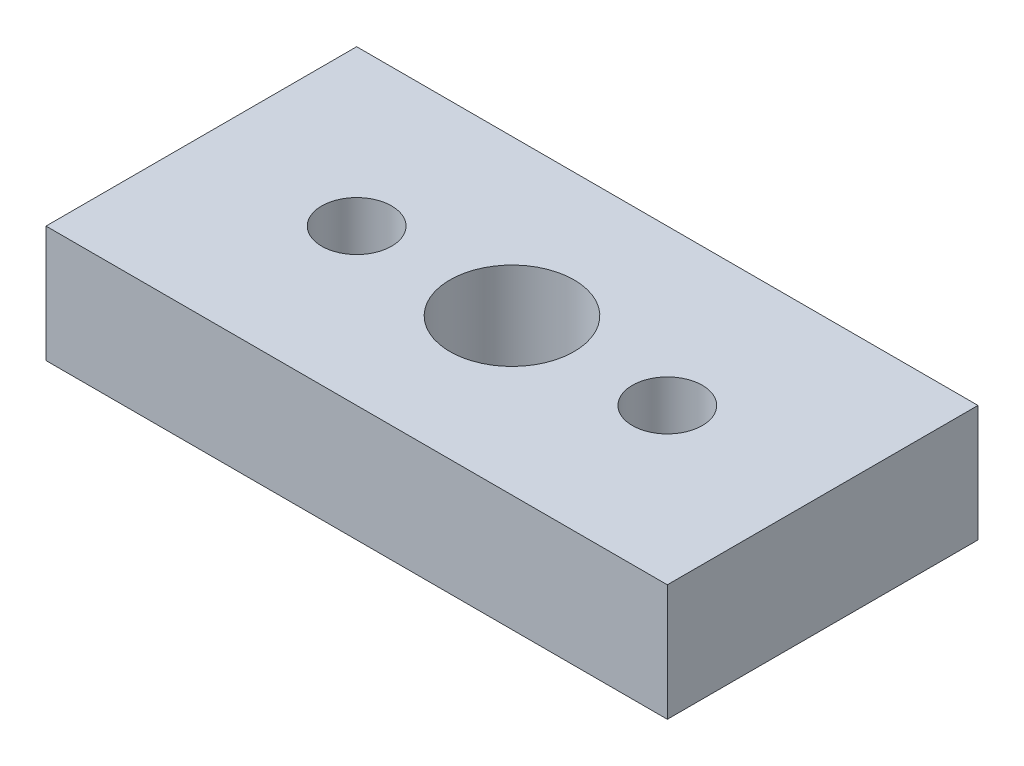
ISO-10303-21;
HEADER;
FILE_DESCRIPTION(('STEP AP214'),'2;1');
FILE_NAME('part.step','',(''),(''),'','','');
FILE_SCHEMA(('AUTOMOTIVE_DESIGN { 1 0 10303 214 1 1 1 1 }'));
ENDSEC;
DATA;
#1=APPLICATION_CONTEXT('core data for automotive mechanical design processes');
#2=APPLICATION_PROTOCOL_DEFINITION('international standard','automotive_design',2000,#1);
#3=PRODUCT_CONTEXT('',#1,'mechanical');
#4=PRODUCT('Part','Part','',(#3));
#5=PRODUCT_RELATED_PRODUCT_CATEGORY('part','',(#4));
#6=PRODUCT_DEFINITION_FORMATION('','',#4);
#7=PRODUCT_DEFINITION_CONTEXT('part definition',#1,'design');
#8=PRODUCT_DEFINITION('design','',#6,#7);
#9=PRODUCT_DEFINITION_SHAPE('','',#8);
#10=(LENGTH_UNIT() NAMED_UNIT(*) SI_UNIT(.MILLI.,.METRE.));
#11=(NAMED_UNIT(*) PLANE_ANGLE_UNIT() SI_UNIT($,.RADIAN.));
#12=(NAMED_UNIT(*) SI_UNIT($,.STERADIAN.) SOLID_ANGLE_UNIT());
#13=UNCERTAINTY_MEASURE_WITH_UNIT(LENGTH_MEASURE(1.E-05),#10,'distance_accuracy_value','');
#14=(GEOMETRIC_REPRESENTATION_CONTEXT(3) GLOBAL_UNCERTAINTY_ASSIGNED_CONTEXT((#13)) GLOBAL_UNIT_ASSIGNED_CONTEXT((#10,
#11,#12)) REPRESENTATION_CONTEXT('',''));
#15=CARTESIAN_POINT('',(0.,0.,0.));
#16=DIRECTION('',(0.,0.,1.));
#17=DIRECTION('',(1.,0.,0.));
#18=AXIS2_PLACEMENT_3D('',#15,#16,#17);
#19=CARTESIAN_POINT('',(-40.,7.5,20.));
#20=DIRECTION('',(-1.,0.,0.));
#21=DIRECTION('',(0.,0.,1.));
#22=AXIS2_PLACEMENT_3D('',#19,#20,#21);
#23=PLANE('',#22);
#24=DIRECTION('',(0.,0.,-1.));
#25=VECTOR('',#24,1.);
#26=CARTESIAN_POINT('',(-40.,-7.5,20.));
#27=LINE('',#26,#25);
#28=CARTESIAN_POINT('',(-40.,-7.5,20.));
#29=VERTEX_POINT('',#28);
#30=CARTESIAN_POINT('',(-40.,-7.5,-20.));
#31=VERTEX_POINT('',#30);
#32=EDGE_CURVE('E90',#29,#31,#27,.T.);
#33=ORIENTED_EDGE('',*,*,#32,.F.);
#34=DIRECTION('',(0.,-1.,0.));
#35=VECTOR('',#34,1.);
#36=CARTESIAN_POINT('',(-40.,7.5,20.));
#37=LINE('',#36,#35);
#38=CARTESIAN_POINT('',(-40.,7.5,20.));
#39=VERTEX_POINT('',#38);
#40=EDGE_CURVE('E11',#39,#29,#37,.T.);
#41=ORIENTED_EDGE('',*,*,#40,.F.);
#42=DIRECTION('',(0.,0.,-1.));
#43=VECTOR('',#42,1.);
#44=CARTESIAN_POINT('',(-40.,7.5,20.));
#45=LINE('',#44,#43);
#46=CARTESIAN_POINT('',(-40.,7.5,-20.));
#47=VERTEX_POINT('',#46);
#48=EDGE_CURVE('E77',#39,#47,#45,.T.);
#49=ORIENTED_EDGE('',*,*,#48,.T.);
#50=DIRECTION('',(0.,-1.,0.));
#51=VECTOR('',#50,1.);
#52=CARTESIAN_POINT('',(-40.,7.5,-20.));
#53=LINE('',#52,#51);
#54=EDGE_CURVE('E20',#47,#31,#53,.T.);
#55=ORIENTED_EDGE('',*,*,#54,.T.);
#56=EDGE_LOOP('',(#33,#41,#49,#55));
#57=FACE_BOUND('',#56,.T.);
#58=ADVANCED_FACE('F17',(#57),#23,.T.);
#59=CARTESIAN_POINT('',(40.,7.5,20.));
#60=DIRECTION('',(0.,0.,1.));
#61=DIRECTION('',(1.,0.,0.));
#62=AXIS2_PLACEMENT_3D('',#59,#60,#61);
#63=PLANE('',#62);
#64=DIRECTION('',(-1.,0.,0.));
#65=VECTOR('',#64,1.);
#66=CARTESIAN_POINT('',(40.,-7.5,20.));
#67=LINE('',#66,#65);
#68=CARTESIAN_POINT('',(40.,-7.5,20.));
#69=VERTEX_POINT('',#68);
#70=EDGE_CURVE('E84',#69,#29,#67,.T.);
#71=ORIENTED_EDGE('',*,*,#70,.F.);
#72=DIRECTION('',(0.,-1.,0.));
#73=VECTOR('',#72,1.);
#74=CARTESIAN_POINT('',(40.,7.5,20.));
#75=LINE('',#74,#73);
#76=CARTESIAN_POINT('',(40.,7.5,20.));
#77=VERTEX_POINT('',#76);
#78=EDGE_CURVE('E27',#77,#69,#75,.T.);
#79=ORIENTED_EDGE('',*,*,#78,.F.);
#80=DIRECTION('',(-1.,0.,0.));
#81=VECTOR('',#80,1.);
#82=CARTESIAN_POINT('',(40.,7.5,20.));
#83=LINE('',#82,#81);
#84=EDGE_CURVE('E73',#77,#39,#83,.T.);
#85=ORIENTED_EDGE('',*,*,#84,.T.);
#86=ORIENTED_EDGE('',*,*,#40,.T.);
#87=EDGE_LOOP('',(#71,#79,#85,#86));
#88=FACE_BOUND('',#87,.T.);
#89=ADVANCED_FACE('F107',(#88),#63,.T.);
#90=CARTESIAN_POINT('',(40.,7.5,-20.));
#91=DIRECTION('',(1.,0.,0.));
#92=DIRECTION('',(0.,0.,-1.));
#93=AXIS2_PLACEMENT_3D('',#90,#91,#92);
#94=PLANE('',#93);
#95=DIRECTION('',(0.,0.,1.));
#96=VECTOR('',#95,1.);
#97=CARTESIAN_POINT('',(40.,-7.5,-20.));
#98=LINE('',#97,#96);
#99=CARTESIAN_POINT('',(40.,-7.5,-20.));
#100=VERTEX_POINT('',#99);
#101=EDGE_CURVE('E68',#100,#69,#98,.T.);
#102=ORIENTED_EDGE('',*,*,#101,.F.);
#103=DIRECTION('',(0.,-1.,0.));
#104=VECTOR('',#103,1.);
#105=CARTESIAN_POINT('',(40.,7.5,-20.));
#106=LINE('',#105,#104);
#107=CARTESIAN_POINT('',(40.,7.5,-20.));
#108=VERTEX_POINT('',#107);
#109=EDGE_CURVE('E63',#108,#100,#106,.T.);
#110=ORIENTED_EDGE('',*,*,#109,.F.);
#111=DIRECTION('',(0.,0.,1.));
#112=VECTOR('',#111,1.);
#113=CARTESIAN_POINT('',(40.,7.5,-20.));
#114=LINE('',#113,#112);
#115=EDGE_CURVE('E66',#108,#77,#114,.T.);
#116=ORIENTED_EDGE('',*,*,#115,.T.);
#117=ORIENTED_EDGE('',*,*,#78,.T.);
#118=EDGE_LOOP('',(#102,#110,#116,#117));
#119=FACE_BOUND('',#118,.T.);
#120=ADVANCED_FACE('F65',(#119),#94,.T.);
#121=CARTESIAN_POINT('',(-40.,7.5,-20.));
#122=DIRECTION('',(0.,0.,-1.));
#123=DIRECTION('',(-1.,0.,0.));
#124=AXIS2_PLACEMENT_3D('',#121,#122,#123);
#125=PLANE('',#124);
#126=DIRECTION('',(1.,0.,0.));
#127=VECTOR('',#126,1.);
#128=CARTESIAN_POINT('',(-40.,-7.5,-20.));
#129=LINE('',#128,#127);
#130=EDGE_CURVE('E94',#31,#100,#129,.T.);
#131=ORIENTED_EDGE('',*,*,#130,.F.);
#132=ORIENTED_EDGE('',*,*,#54,.F.);
#133=DIRECTION('',(1.,0.,0.));
#134=VECTOR('',#133,1.);
#135=CARTESIAN_POINT('',(-40.,7.5,-20.));
#136=LINE('',#135,#134);
#137=EDGE_CURVE('E72',#47,#108,#136,.T.);
#138=ORIENTED_EDGE('',*,*,#137,.T.);
#139=ORIENTED_EDGE('',*,*,#109,.T.);
#140=EDGE_LOOP('',(#131,#132,#138,#139));
#141=FACE_BOUND('',#140,.T.);
#142=ADVANCED_FACE('F75',(#141),#125,.T.);
#143=CARTESIAN_POINT('',(0.,7.5,0.));
#144=DIRECTION('',(0.,-1.,0.));
#145=DIRECTION('',(0.,0.,-1.));
#146=AXIS2_PLACEMENT_3D('',#143,#144,#145);
#147=PLANE('',#146);
#148=CARTESIAN_POINT('',(-20.,7.5,0.));
#149=DIRECTION('',(0.,-1.,0.));
#150=DIRECTION('',(0.,0.,-1.));
#151=AXIS2_PLACEMENT_3D('',#148,#149,#150);
#152=CIRCLE('',#151,4.5);
#153=CARTESIAN_POINT('',(-20.,7.5,-4.5));
#154=VERTEX_POINT('',#153);
#155=EDGE_CURVE('E181',#154,#154,#152,.T.);
#156=ORIENTED_EDGE('',*,*,#155,.T.);
#157=EDGE_LOOP('',(#156));
#158=FACE_BOUND('',#157,.T.);
#159=CARTESIAN_POINT('',(20.,7.5,0.));
#160=DIRECTION('',(0.,-1.,0.));
#161=DIRECTION('',(0.,0.,-1.));
#162=AXIS2_PLACEMENT_3D('',#159,#160,#161);
#163=CIRCLE('',#162,4.5);
#164=CARTESIAN_POINT('',(20.,7.5,-4.50000000000001));
#165=VERTEX_POINT('',#164);
#166=EDGE_CURVE('E195',#165,#165,#163,.T.);
#167=ORIENTED_EDGE('',*,*,#166,.T.);
#168=EDGE_LOOP('',(#167));
#169=FACE_BOUND('',#168,.T.);
#170=CARTESIAN_POINT('',(0.,7.5,0.));
#171=DIRECTION('',(0.,-1.,0.));
#172=DIRECTION('',(0.,0.,-1.));
#173=AXIS2_PLACEMENT_3D('',#170,#171,#172);
#174=CIRCLE('',#173,8.);
#175=CARTESIAN_POINT('',(0.,7.5,-8.));
#176=VERTEX_POINT('',#175);
#177=EDGE_CURVE('E95',#176,#176,#174,.T.);
#178=ORIENTED_EDGE('',*,*,#177,.T.);
#179=EDGE_LOOP('',(#178));
#180=FACE_BOUND('',#179,.T.);
#181=ORIENTED_EDGE('',*,*,#48,.F.);
#182=ORIENTED_EDGE('',*,*,#84,.F.);
#183=ORIENTED_EDGE('',*,*,#115,.F.);
#184=ORIENTED_EDGE('',*,*,#137,.F.);
#185=EDGE_LOOP('',(#181,#182,#183,#184));
#186=FACE_BOUND('',#185,.T.);
#187=ADVANCED_FACE('F71',(#158,#169,#180,#186),#147,.F.);
#188=CARTESIAN_POINT('',(0.,-7.5,0.));
#189=DIRECTION('',(0.,-1.,0.));
#190=DIRECTION('',(0.,0.,-1.));
#191=AXIS2_PLACEMENT_3D('',#188,#189,#190);
#192=PLANE('',#191);
#193=CARTESIAN_POINT('',(-20.,-7.5,0.));
#194=DIRECTION('',(0.,-1.,0.));
#195=DIRECTION('',(0.,0.,-1.));
#196=AXIS2_PLACEMENT_3D('',#193,#194,#195);
#197=CIRCLE('',#196,6.5);
#198=CARTESIAN_POINT('',(-20.,-7.5,-6.5));
#199=VERTEX_POINT('',#198);
#200=EDGE_CURVE('E169',#199,#199,#197,.T.);
#201=ORIENTED_EDGE('',*,*,#200,.F.);
#202=EDGE_LOOP('',(#201));
#203=FACE_BOUND('',#202,.T.);
#204=CARTESIAN_POINT('',(20.,-7.5,0.));
#205=DIRECTION('',(0.,-1.,0.));
#206=DIRECTION('',(0.,0.,-1.));
#207=AXIS2_PLACEMENT_3D('',#204,#205,#206);
#208=CIRCLE('',#207,6.5);
#209=CARTESIAN_POINT('',(20.,-7.5,-6.50000000000001));
#210=VERTEX_POINT('',#209);
#211=EDGE_CURVE('E183',#210,#210,#208,.T.);
#212=ORIENTED_EDGE('',*,*,#211,.F.);
#213=EDGE_LOOP('',(#212));
#214=FACE_BOUND('',#213,.T.);
#215=CARTESIAN_POINT('',(0.,-7.5,0.));
#216=DIRECTION('',(0.,-1.,0.));
#217=DIRECTION('',(0.,0.,-1.));
#218=AXIS2_PLACEMENT_3D('',#215,#216,#217);
#219=CIRCLE('',#218,8.);
#220=CARTESIAN_POINT('',(0.,-7.5,-8.));
#221=VERTEX_POINT('',#220);
#222=EDGE_CURVE('E199',#221,#221,#219,.T.);
#223=ORIENTED_EDGE('',*,*,#222,.F.);
#224=EDGE_LOOP('',(#223));
#225=FACE_BOUND('',#224,.T.);
#226=ORIENTED_EDGE('',*,*,#32,.T.);
#227=ORIENTED_EDGE('',*,*,#130,.T.);
#228=ORIENTED_EDGE('',*,*,#101,.T.);
#229=ORIENTED_EDGE('',*,*,#70,.T.);
#230=EDGE_LOOP('',(#226,#227,#228,#229));
#231=FACE_BOUND('',#230,.T.);
#232=ADVANCED_FACE('F106',(#203,#214,#225,#231),#192,.T.);
#233=CARTESIAN_POINT('',(0.,-7.5,0.));
#234=DIRECTION('',(0.,-1.,0.));
#235=DIRECTION('',(0.,0.,-1.));
#236=AXIS2_PLACEMENT_3D('',#233,#234,#235);
#237=CYLINDRICAL_SURFACE('',#236,8.);
#238=ORIENTED_EDGE('',*,*,#177,.F.);
#239=EDGE_LOOP('',(#238));
#240=FACE_BOUND('',#239,.T.);
#241=ORIENTED_EDGE('',*,*,#222,.T.);
#242=EDGE_LOOP('',(#241));
#243=FACE_BOUND('',#242,.T.);
#244=ADVANCED_FACE('F129',(#240,#243),#237,.F.);
#245=CARTESIAN_POINT('',(20.,-7.5,0.));
#246=DIRECTION('',(0.,-1.,0.));
#247=DIRECTION('',(0.,0.,-1.));
#248=AXIS2_PLACEMENT_3D('',#245,#246,#247);
#249=CYLINDRICAL_SURFACE('',#248,4.5);
#250=ORIENTED_EDGE('',*,*,#166,.F.);
#251=EDGE_LOOP('',(#250));
#252=FACE_BOUND('',#251,.T.);
#253=CARTESIAN_POINT('',(20.,0.5,0.));
#254=DIRECTION('',(0.,-1.,0.));
#255=DIRECTION('',(0.,0.,-1.));
#256=AXIS2_PLACEMENT_3D('',#253,#254,#255);
#257=CIRCLE('',#256,4.5);
#258=CARTESIAN_POINT('',(20.,0.5,-4.50000000000001));
#259=VERTEX_POINT('',#258);
#260=EDGE_CURVE('E191',#259,#259,#257,.T.);
#261=ORIENTED_EDGE('',*,*,#260,.T.);
#262=EDGE_LOOP('',(#261));
#263=FACE_BOUND('',#262,.T.);
#264=ADVANCED_FACE('F136',(#252,#263),#249,.F.);
#265=CARTESIAN_POINT('',(24.5,0.5,0.));
#266=DIRECTION('',(0.,1.,0.));
#267=DIRECTION('',(0.,0.,1.));
#268=AXIS2_PLACEMENT_3D('',#265,#266,#267);
#269=PLANE('',#268);
#270=ORIENTED_EDGE('',*,*,#260,.F.);
#271=EDGE_LOOP('',(#270));
#272=FACE_BOUND('',#271,.T.);
#273=CARTESIAN_POINT('',(20.,0.5,0.));
#274=DIRECTION('',(0.,-1.,0.));
#275=DIRECTION('',(0.,0.,-1.));
#276=AXIS2_PLACEMENT_3D('',#273,#274,#275);
#277=CIRCLE('',#276,6.5);
#278=CARTESIAN_POINT('',(20.,0.5,-6.50000000000001));
#279=VERTEX_POINT('',#278);
#280=EDGE_CURVE('E187',#279,#279,#277,.T.);
#281=ORIENTED_EDGE('',*,*,#280,.T.);
#282=EDGE_LOOP('',(#281));
#283=FACE_BOUND('',#282,.T.);
#284=ADVANCED_FACE('F140',(#272,#283),#269,.F.);
#285=CARTESIAN_POINT('',(20.,-7.5,0.));
#286=DIRECTION('',(0.,-1.,0.));
#287=DIRECTION('',(0.,0.,-1.));
#288=AXIS2_PLACEMENT_3D('',#285,#286,#287);
#289=CYLINDRICAL_SURFACE('',#288,6.5);
#290=ORIENTED_EDGE('',*,*,#280,.F.);
#291=EDGE_LOOP('',(#290));
#292=FACE_BOUND('',#291,.T.);
#293=ORIENTED_EDGE('',*,*,#211,.T.);
#294=EDGE_LOOP('',(#293));
#295=FACE_BOUND('',#294,.T.);
#296=ADVANCED_FACE('F144',(#292,#295),#289,.F.);
#297=CARTESIAN_POINT('',(-20.,-7.5,0.));
#298=DIRECTION('',(0.,-1.,0.));
#299=DIRECTION('',(0.,0.,-1.));
#300=AXIS2_PLACEMENT_3D('',#297,#298,#299);
#301=CYLINDRICAL_SURFACE('',#300,4.5);
#302=ORIENTED_EDGE('',*,*,#155,.F.);
#303=EDGE_LOOP('',(#302));
#304=FACE_BOUND('',#303,.T.);
#305=CARTESIAN_POINT('',(-20.,0.5,0.));
#306=DIRECTION('',(0.,-1.,0.));
#307=DIRECTION('',(0.,0.,-1.));
#308=AXIS2_PLACEMENT_3D('',#305,#306,#307);
#309=CIRCLE('',#308,4.5);
#310=CARTESIAN_POINT('',(-20.,0.5,-4.5));
#311=VERTEX_POINT('',#310);
#312=EDGE_CURVE('E175',#311,#311,#309,.T.);
#313=ORIENTED_EDGE('',*,*,#312,.T.);
#314=EDGE_LOOP('',(#313));
#315=FACE_BOUND('',#314,.T.);
#316=ADVANCED_FACE('F148',(#304,#315),#301,.F.);
#317=CARTESIAN_POINT('',(-15.5,0.5,0.));
#318=DIRECTION('',(0.,1.,0.));
#319=DIRECTION('',(0.,0.,1.));
#320=AXIS2_PLACEMENT_3D('',#317,#318,#319);
#321=PLANE('',#320);
#322=ORIENTED_EDGE('',*,*,#312,.F.);
#323=EDGE_LOOP('',(#322));
#324=FACE_BOUND('',#323,.T.);
#325=CARTESIAN_POINT('',(-20.,0.5,0.));
#326=DIRECTION('',(0.,-1.,0.));
#327=DIRECTION('',(0.,0.,-1.));
#328=AXIS2_PLACEMENT_3D('',#325,#326,#327);
#329=CIRCLE('',#328,6.5);
#330=CARTESIAN_POINT('',(-20.,0.5,-6.5));
#331=VERTEX_POINT('',#330);
#332=EDGE_CURVE('E166',#331,#331,#329,.T.);
#333=ORIENTED_EDGE('',*,*,#332,.T.);
#334=EDGE_LOOP('',(#333));
#335=FACE_BOUND('',#334,.T.);
#336=ADVANCED_FACE('F152',(#324,#335),#321,.F.);
#337=CARTESIAN_POINT('',(-20.,-7.5,0.));
#338=DIRECTION('',(0.,-1.,0.));
#339=DIRECTION('',(0.,0.,-1.));
#340=AXIS2_PLACEMENT_3D('',#337,#338,#339);
#341=CYLINDRICAL_SURFACE('',#340,6.5);
#342=ORIENTED_EDGE('',*,*,#332,.F.);
#343=EDGE_LOOP('',(#342));
#344=FACE_BOUND('',#343,.T.);
#345=ORIENTED_EDGE('',*,*,#200,.T.);
#346=EDGE_LOOP('',(#345));
#347=FACE_BOUND('',#346,.T.);
#348=ADVANCED_FACE('F156',(#344,#347),#341,.F.);
#349=CLOSED_SHELL('',(#58,#89,#120,#142,#187,#232,#244,#264,#284,#296,#316,#336,#348));
#350=MANIFOLD_SOLID_BREP('B1',#349);
#351=ADVANCED_BREP_SHAPE_REPRESENTATION('',(#18,#350),#14);
#352=SHAPE_DEFINITION_REPRESENTATION(#9,#351);
ENDSEC;
END-ISO-10303-21;
